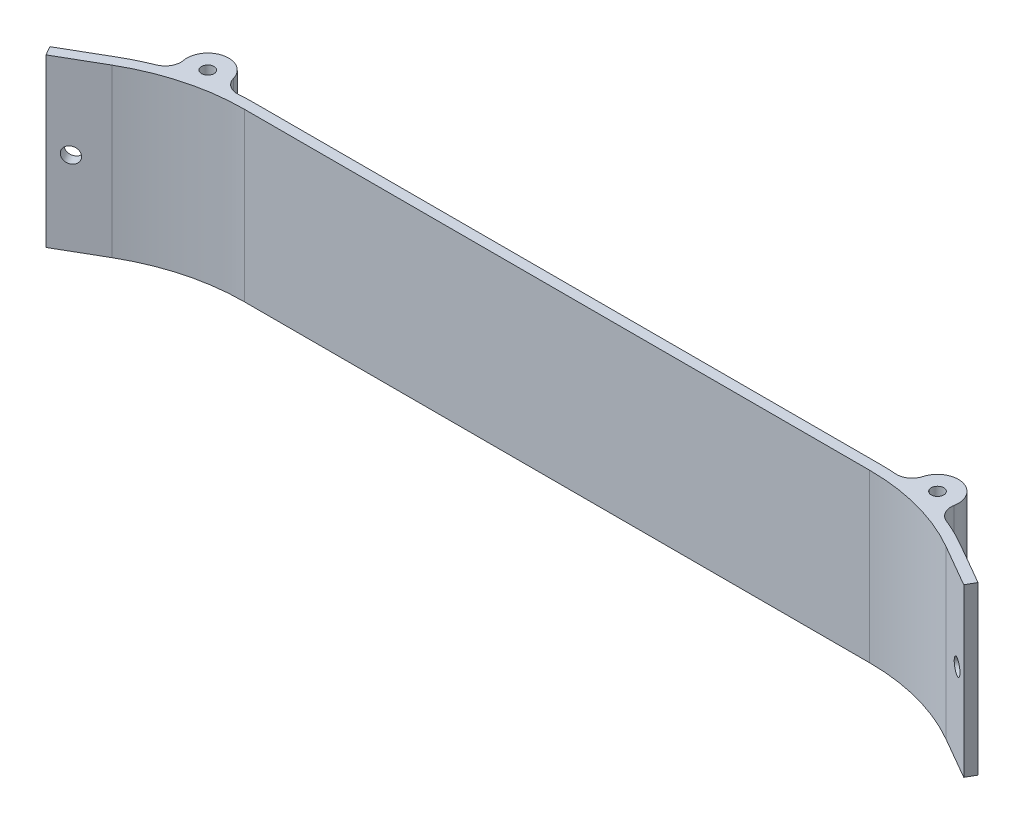
ISO-10303-21;
HEADER;
FILE_DESCRIPTION(('STEP AP214'),'2;1');
FILE_NAME('part.step','',(''),(''),'','','');
FILE_SCHEMA(('AUTOMOTIVE_DESIGN { 1 0 10303 214 1 1 1 1 }'));
ENDSEC;
DATA;
#1=APPLICATION_CONTEXT('core data for automotive mechanical design processes');
#2=APPLICATION_PROTOCOL_DEFINITION('international standard','automotive_design',2000,#1);
#3=PRODUCT_CONTEXT('',#1,'mechanical');
#4=PRODUCT('Part','Part','',(#3));
#5=PRODUCT_RELATED_PRODUCT_CATEGORY('part','',(#4));
#6=PRODUCT_DEFINITION_FORMATION('','',#4);
#7=PRODUCT_DEFINITION_CONTEXT('part definition',#1,'design');
#8=PRODUCT_DEFINITION('design','',#6,#7);
#9=PRODUCT_DEFINITION_SHAPE('','',#8);
#10=(LENGTH_UNIT() NAMED_UNIT(*) SI_UNIT(.MILLI.,.METRE.));
#11=(NAMED_UNIT(*) PLANE_ANGLE_UNIT() SI_UNIT($,.RADIAN.));
#12=(NAMED_UNIT(*) SI_UNIT($,.STERADIAN.) SOLID_ANGLE_UNIT());
#13=UNCERTAINTY_MEASURE_WITH_UNIT(LENGTH_MEASURE(1.E-05),#10,'distance_accuracy_value','');
#14=(GEOMETRIC_REPRESENTATION_CONTEXT(3) GLOBAL_UNCERTAINTY_ASSIGNED_CONTEXT((#13)) GLOBAL_UNIT_ASSIGNED_CONTEXT((#10,
#11,#12)) REPRESENTATION_CONTEXT('',''));
#15=CARTESIAN_POINT('',(0.,0.,0.));
#16=DIRECTION('',(0.,0.,1.));
#17=DIRECTION('',(1.,0.,0.));
#18=AXIS2_PLACEMENT_3D('',#15,#16,#17);
#19=CARTESIAN_POINT('',(-60.,32.,40.));
#20=DIRECTION('',(0.,-1.,0.));
#21=DIRECTION('',(0.,0.,-1.));
#22=AXIS2_PLACEMENT_3D('',#19,#20,#21);
#23=CYLINDRICAL_SURFACE('',#22,42.);
#24=CARTESIAN_POINT('',(-60.,0.,40.));
#25=DIRECTION('',(0.,1.,0.));
#26=DIRECTION('',(1.,0.,0.));
#27=AXIS2_PLACEMENT_3D('',#24,#25,#26);
#28=CIRCLE('',#27,42.);
#29=CARTESIAN_POINT('',(-60.,0.,-1.99999999999999));
#30=VERTEX_POINT('',#29);
#31=CARTESIAN_POINT('',(-63.0405375937342,0.,-1.8897974588215));
#32=VERTEX_POINT('',#31);
#33=EDGE_CURVE('E269',#30,#32,#28,.T.);
#34=ORIENTED_EDGE('',*,*,#33,.T.);
#35=DIRECTION('',(0.,-1.,0.));
#36=VECTOR('',#35,1.);
#37=CARTESIAN_POINT('',(-63.0405375937342,32.,-1.8897974588215));
#38=LINE('',#37,#36);
#39=CARTESIAN_POINT('',(-63.0405375937342,32.,-1.8897974588215));
#40=VERTEX_POINT('',#39);
#41=EDGE_CURVE('E325',#32,#40,#38,.F.);
#42=ORIENTED_EDGE('',*,*,#41,.T.);
#43=CARTESIAN_POINT('',(-60.,32.,40.));
#44=DIRECTION('',(0.,1.,0.));
#45=DIRECTION('',(1.,0.,0.));
#46=AXIS2_PLACEMENT_3D('',#43,#44,#45);
#47=CIRCLE('',#46,42.);
#48=CARTESIAN_POINT('',(-60.,32.,-1.99999999999999));
#49=VERTEX_POINT('',#48);
#50=EDGE_CURVE('E284',#49,#40,#47,.T.);
#51=ORIENTED_EDGE('',*,*,#50,.F.);
#52=DIRECTION('',(0.,-1.,0.));
#53=VECTOR('',#52,1.);
#54=CARTESIAN_POINT('',(-60.,32.,-1.99999999999999));
#55=LINE('',#54,#53);
#56=EDGE_CURVE('E308',#49,#30,#55,.T.);
#57=ORIENTED_EDGE('',*,*,#56,.T.);
#58=EDGE_LOOP('',(#34,#42,#51,#57));
#59=FACE_BOUND('',#58,.T.);
#60=ADVANCED_FACE('F32',(#59),#23,.T.);
#61=CARTESIAN_POINT('',(-75.7554261483558,32.,1.06715336783471));
#62=VERTEX_POINT('',#61);
#63=CARTESIAN_POINT('',(-81.,32.,3.62693304105363));
#64=VERTEX_POINT('',#63);
#65=EDGE_CURVE('E283',#62,#64,#47,.T.);
#66=ORIENTED_EDGE('',*,*,#65,.F.);
#67=DIRECTION('',(0.,-1.,0.));
#68=VECTOR('',#67,1.);
#69=CARTESIAN_POINT('',(-75.7554261483558,32.,1.0671533678347));
#70=LINE('',#69,#68);
#71=CARTESIAN_POINT('',(-75.7554261483558,0.,1.06715336783471));
#72=VERTEX_POINT('',#71);
#73=EDGE_CURVE('E53',#62,#72,#70,.T.);
#74=ORIENTED_EDGE('',*,*,#73,.T.);
#75=CARTESIAN_POINT('',(-81.,0.,3.62693304105363));
#76=VERTEX_POINT('',#75);
#77=EDGE_CURVE('E303',#72,#76,#28,.T.);
#78=ORIENTED_EDGE('',*,*,#77,.T.);
#79=DIRECTION('',(0.,-1.,0.));
#80=VECTOR('',#79,1.);
#81=CARTESIAN_POINT('',(-81.,32.,3.62693304105363));
#82=LINE('',#81,#80);
#83=EDGE_CURVE('E286',#64,#76,#82,.T.);
#84=ORIENTED_EDGE('',*,*,#83,.F.);
#85=EDGE_LOOP('',(#66,#74,#78,#84));
#86=FACE_BOUND('',#85,.T.);
#87=ADVANCED_FACE('F400',(#86),#23,.T.);
#88=CARTESIAN_POINT('',(-81.,32.,3.62693304105363));
#89=DIRECTION('',(0.500000000000001,0.,0.866025403784438));
#90=DIRECTION('',(0.866025403784438,0.,-0.500000000000001));
#91=AXIS2_PLACEMENT_3D('',#88,#89,#90);
#92=PLANE('',#91);
#93=CARTESIAN_POINT('',(-86.0073868596882,16.,6.51794919243116));
#94=DIRECTION('',(0.500000000000001,0.,0.866025403784438));
#95=DIRECTION('',(0.866025403784438,0.,-0.500000000000001));
#96=AXIS2_PLACEMENT_3D('',#93,#94,#95);
#97=CIRCLE('',#96,1.5);
#98=CARTESIAN_POINT('',(-84.7083487540115,16.,5.76794919243116));
#99=VERTEX_POINT('',#98);
#100=EDGE_CURVE('E251',#99,#99,#97,.T.);
#101=ORIENTED_EDGE('',*,*,#100,.T.);
#102=EDGE_LOOP('',(#101));
#103=FACE_BOUND('',#102,.T.);
#104=DIRECTION('',(-0.866025403784438,0.,0.500000000000001));
#105=VECTOR('',#104,1.);
#106=CARTESIAN_POINT('',(-81.,0.,3.62693304105363));
#107=LINE('',#106,#105);
#108=CARTESIAN_POINT('',(-89.0384757729337,0.,8.26794919243116));
#109=VERTEX_POINT('',#108);
#110=EDGE_CURVE('E257',#76,#109,#107,.T.);
#111=ORIENTED_EDGE('',*,*,#110,.T.);
#112=DIRECTION('',(0.,-1.,0.));
#113=VECTOR('',#112,1.);
#114=CARTESIAN_POINT('',(-89.0384757729337,32.,8.26794919243116));
#115=LINE('',#114,#113);
#116=CARTESIAN_POINT('',(-89.0384757729337,32.,8.26794919243116));
#117=VERTEX_POINT('',#116);
#118=EDGE_CURVE('E317',#117,#109,#115,.T.);
#119=ORIENTED_EDGE('',*,*,#118,.F.);
#120=DIRECTION('',(-0.866025403784438,0.,0.500000000000001));
#121=VECTOR('',#120,1.);
#122=CARTESIAN_POINT('',(-81.,32.,3.62693304105363));
#123=LINE('',#122,#121);
#124=EDGE_CURVE('E266',#64,#117,#123,.T.);
#125=ORIENTED_EDGE('',*,*,#124,.F.);
#126=ORIENTED_EDGE('',*,*,#83,.T.);
#127=EDGE_LOOP('',(#111,#119,#125,#126));
#128=FACE_BOUND('',#127,.T.);
#129=ADVANCED_FACE('F405',(#103,#128),#92,.F.);
#130=CARTESIAN_POINT('',(-88.0384757729337,32.,10.));
#131=DIRECTION('',(-0.866025403784438,0.,0.500000000000001));
#132=DIRECTION('',(0.500000000000001,0.,0.866025403784438));
#133=AXIS2_PLACEMENT_3D('',#130,#131,#132);
#134=PLANE('',#133);
#135=DIRECTION('',(-0.500000000000001,0.,-0.866025403784438));
#136=VECTOR('',#135,1.);
#137=CARTESIAN_POINT('',(-88.0384757729337,0.,10.));
#138=LINE('',#137,#136);
#139=CARTESIAN_POINT('',(-88.0384757729337,0.,10.));
#140=VERTEX_POINT('',#139);
#141=EDGE_CURVE('E289',#140,#109,#138,.T.);
#142=ORIENTED_EDGE('',*,*,#141,.F.);
#143=DIRECTION('',(0.,-1.,0.));
#144=VECTOR('',#143,1.);
#145=CARTESIAN_POINT('',(-88.0384757729337,32.,10.));
#146=LINE('',#145,#144);
#147=CARTESIAN_POINT('',(-88.0384757729337,32.,10.));
#148=VERTEX_POINT('',#147);
#149=EDGE_CURVE('E315',#148,#140,#146,.T.);
#150=ORIENTED_EDGE('',*,*,#149,.F.);
#151=DIRECTION('',(-0.500000000000001,0.,-0.866025403784438));
#152=VECTOR('',#151,1.);
#153=CARTESIAN_POINT('',(-88.0384757729337,32.,10.));
#154=LINE('',#153,#152);
#155=EDGE_CURVE('E268',#148,#117,#154,.T.);
#156=ORIENTED_EDGE('',*,*,#155,.T.);
#157=ORIENTED_EDGE('',*,*,#118,.T.);
#158=EDGE_LOOP('',(#142,#150,#156,#157));
#159=FACE_BOUND('',#158,.T.);
#160=ADVANCED_FACE('F422',(#159),#134,.T.);
#161=CARTESIAN_POINT('',(-80.,32.,5.3589838486225));
#162=DIRECTION('',(0.500000000000001,0.,0.866025403784438));
#163=DIRECTION('',(0.866025403784438,0.,-0.500000000000001));
#164=AXIS2_PLACEMENT_3D('',#161,#162,#163);
#165=PLANE('',#164);
#166=CARTESIAN_POINT('',(-85.0073868596882,16.,8.25000000000004));
#167=DIRECTION('',(0.500000000000001,0.,0.866025403784438));
#168=DIRECTION('',(0.866025403784438,0.,-0.500000000000001));
#169=AXIS2_PLACEMENT_3D('',#166,#167,#168);
#170=CIRCLE('',#169,1.5);
#171=CARTESIAN_POINT('',(-83.7083487540115,16.,7.50000000000003));
#172=VERTEX_POINT('',#171);
#173=EDGE_CURVE('E248',#172,#172,#170,.T.);
#174=ORIENTED_EDGE('',*,*,#173,.F.);
#175=EDGE_LOOP('',(#174));
#176=FACE_BOUND('',#175,.T.);
#177=DIRECTION('',(-0.866025403784438,0.,0.500000000000001));
#178=VECTOR('',#177,1.);
#179=CARTESIAN_POINT('',(-80.,0.,5.3589838486225));
#180=LINE('',#179,#178);
#181=CARTESIAN_POINT('',(-80.,0.,5.3589838486225));
#182=VERTEX_POINT('',#181);
#183=EDGE_CURVE('E292',#182,#140,#180,.T.);
#184=ORIENTED_EDGE('',*,*,#183,.F.);
#185=DIRECTION('',(0.,-1.,0.));
#186=VECTOR('',#185,1.);
#187=CARTESIAN_POINT('',(-80.,32.,5.3589838486225));
#188=LINE('',#187,#186);
#189=CARTESIAN_POINT('',(-80.,32.,5.3589838486225));
#190=VERTEX_POINT('',#189);
#191=EDGE_CURVE('E313',#190,#182,#188,.T.);
#192=ORIENTED_EDGE('',*,*,#191,.F.);
#193=DIRECTION('',(-0.866025403784438,0.,0.500000000000001));
#194=VECTOR('',#193,1.);
#195=CARTESIAN_POINT('',(-80.,32.,5.3589838486225));
#196=LINE('',#195,#194);
#197=EDGE_CURVE('E272',#190,#148,#196,.T.);
#198=ORIENTED_EDGE('',*,*,#197,.T.);
#199=ORIENTED_EDGE('',*,*,#149,.T.);
#200=EDGE_LOOP('',(#184,#192,#198,#199));
#201=FACE_BOUND('',#200,.T.);
#202=ADVANCED_FACE('F418',(#176,#201),#165,.T.);
#203=CARTESIAN_POINT('',(-60.,32.,40.));
#204=DIRECTION('',(0.,-1.,0.));
#205=DIRECTION('',(0.,0.,-1.));
#206=AXIS2_PLACEMENT_3D('',#203,#204,#205);
#207=CYLINDRICAL_SURFACE('',#206,40.);
#208=CARTESIAN_POINT('',(-60.,0.,40.));
#209=DIRECTION('',(0.,1.,0.));
#210=DIRECTION('',(0.,0.,1.));
#211=AXIS2_PLACEMENT_3D('',#208,#209,#210);
#212=CIRCLE('',#211,40.);
#213=CARTESIAN_POINT('',(-60.,0.,0.));
#214=VERTEX_POINT('',#213);
#215=EDGE_CURVE('E295',#214,#182,#212,.T.);
#216=ORIENTED_EDGE('',*,*,#215,.F.);
#217=DIRECTION('',(0.,-1.,0.));
#218=VECTOR('',#217,1.);
#219=CARTESIAN_POINT('',(-60.,32.,0.));
#220=LINE('',#219,#218);
#221=CARTESIAN_POINT('',(-60.,32.,0.));
#222=VERTEX_POINT('',#221);
#223=EDGE_CURVE('E311',#222,#214,#220,.T.);
#224=ORIENTED_EDGE('',*,*,#223,.F.);
#225=CARTESIAN_POINT('',(-60.,32.,40.));
#226=DIRECTION('',(0.,1.,0.));
#227=DIRECTION('',(0.,0.,1.));
#228=AXIS2_PLACEMENT_3D('',#225,#226,#227);
#229=CIRCLE('',#228,40.);
#230=EDGE_CURVE('E275',#222,#190,#229,.T.);
#231=ORIENTED_EDGE('',*,*,#230,.T.);
#232=ORIENTED_EDGE('',*,*,#191,.T.);
#233=EDGE_LOOP('',(#216,#224,#231,#232));
#234=FACE_BOUND('',#233,.T.);
#235=ADVANCED_FACE('F414',(#234),#207,.F.);
#236=CARTESIAN_POINT('',(0.,32.,0.));
#237=DIRECTION('',(0.,0.,1.));
#238=DIRECTION('',(1.,0.,0.));
#239=AXIS2_PLACEMENT_3D('',#236,#237,#238);
#240=PLANE('',#239);
#241=DIRECTION('',(-1.,0.,0.));
#242=VECTOR('',#241,1.);
#243=CARTESIAN_POINT('',(0.,0.,0.));
#244=LINE('',#243,#242);
#245=CARTESIAN_POINT('',(60.,0.,0.));
#246=VERTEX_POINT('',#245);
#247=EDGE_CURVE('E298',#246,#214,#244,.T.);
#248=ORIENTED_EDGE('',*,*,#247,.F.);
#249=DIRECTION('',(0.,-1.,0.));
#250=VECTOR('',#249,1.);
#251=CARTESIAN_POINT('',(60.,32.,0.));
#252=LINE('',#251,#250);
#253=CARTESIAN_POINT('',(60.,32.,0.));
#254=VERTEX_POINT('',#253);
#255=EDGE_CURVE('E222',#254,#246,#252,.T.);
#256=ORIENTED_EDGE('',*,*,#255,.F.);
#257=DIRECTION('',(-1.,0.,0.));
#258=VECTOR('',#257,1.);
#259=CARTESIAN_POINT('',(0.,32.,0.));
#260=LINE('',#259,#258);
#261=EDGE_CURVE('E278',#254,#222,#260,.T.);
#262=ORIENTED_EDGE('',*,*,#261,.T.);
#263=ORIENTED_EDGE('',*,*,#223,.T.);
#264=EDGE_LOOP('',(#248,#256,#262,#263));
#265=FACE_BOUND('',#264,.T.);
#266=ADVANCED_FACE('F411',(#265),#240,.T.);
#267=CARTESIAN_POINT('',(0.,32.,-2.));
#268=DIRECTION('',(0.,0.,1.));
#269=DIRECTION('',(1.,0.,0.));
#270=AXIS2_PLACEMENT_3D('',#267,#268,#269);
#271=PLANE('',#270);
#272=DIRECTION('',(-1.,0.,0.));
#273=VECTOR('',#272,1.);
#274=CARTESIAN_POINT('',(0.,0.,-2.));
#275=LINE('',#274,#273);
#276=CARTESIAN_POINT('',(60.,0.,-2.));
#277=VERTEX_POINT('',#276);
#278=EDGE_CURVE('E301',#277,#30,#275,.T.);
#279=ORIENTED_EDGE('',*,*,#278,.T.);
#280=ORIENTED_EDGE('',*,*,#56,.F.);
#281=DIRECTION('',(-1.,0.,0.));
#282=VECTOR('',#281,1.);
#283=CARTESIAN_POINT('',(0.,32.,-2.));
#284=LINE('',#283,#282);
#285=CARTESIAN_POINT('',(60.,32.,-2.));
#286=VERTEX_POINT('',#285);
#287=EDGE_CURVE('E281',#286,#49,#284,.T.);
#288=ORIENTED_EDGE('',*,*,#287,.F.);
#289=DIRECTION('',(0.,-1.,0.));
#290=VECTOR('',#289,1.);
#291=CARTESIAN_POINT('',(60.,32.,-2.));
#292=LINE('',#291,#290);
#293=EDGE_CURVE('E219',#286,#277,#292,.T.);
#294=ORIENTED_EDGE('',*,*,#293,.T.);
#295=EDGE_LOOP('',(#279,#280,#288,#294));
#296=FACE_BOUND('',#295,.T.);
#297=ADVANCED_FACE('F349',(#296),#271,.F.);
#298=CARTESIAN_POINT('',(-60.,32.,40.));
#299=DIRECTION('',(0.,1.,0.));
#300=DIRECTION('',(1.,0.,0.));
#301=AXIS2_PLACEMENT_3D('',#298,#299,#300);
#302=PLANE('',#301);
#303=ORIENTED_EDGE('',*,*,#50,.T.);
#304=CARTESIAN_POINT('',(-63.2577188504295,32.,-4.88192584873733));
#305=DIRECTION('',(0.,1.,0.));
#306=DIRECTION('',(0.,0.,1.));
#307=AXIS2_PLACEMENT_3D('',#304,#305,#306);
#308=CIRCLE('',#307,3.);
#309=CARTESIAN_POINT('',(-66.1472679145311,32.,-4.07538619927847));
#310=VERTEX_POINT('',#309);
#311=EDGE_CURVE('E330',#40,#310,#308,.F.);
#312=ORIENTED_EDGE('',*,*,#311,.T.);
#313=CARTESIAN_POINT('',(-70.,32.,-3.));
#314=DIRECTION('',(0.,1.,0.));
#315=DIRECTION('',(0.,0.,1.));
#316=AXIS2_PLACEMENT_3D('',#313,#314,#315);
#317=CIRCLE('',#316,4.00000000000001);
#318=CARTESIAN_POINT('',(-73.9318935602178,32.,-2.26500814214202));
#319=VERTEX_POINT('',#318);
#320=EDGE_CURVE('E255',#310,#319,#317,.T.);
#321=ORIENTED_EDGE('',*,*,#320,.T.);
#322=CARTESIAN_POINT('',(-76.8808137303812,32.,-1.71376424874854));
#323=DIRECTION('',(0.,1.,0.));
#324=DIRECTION('',(0.,0.,1.));
#325=AXIS2_PLACEMENT_3D('',#322,#323,#324);
#326=CIRCLE('',#325,3.);
#327=EDGE_CURVE('E40',#319,#62,#326,.F.);
#328=ORIENTED_EDGE('',*,*,#327,.T.);
#329=ORIENTED_EDGE('',*,*,#65,.T.);
#330=ORIENTED_EDGE('',*,*,#124,.T.);
#331=ORIENTED_EDGE('',*,*,#155,.F.);
#332=ORIENTED_EDGE('',*,*,#197,.F.);
#333=ORIENTED_EDGE('',*,*,#230,.F.);
#334=ORIENTED_EDGE('',*,*,#261,.F.);
#335=CARTESIAN_POINT('',(60.,32.,40.));
#336=DIRECTION('',(0.,-1.,0.));
#337=DIRECTION('',(0.,0.,1.));
#338=AXIS2_PLACEMENT_3D('',#335,#336,#337);
#339=CIRCLE('',#338,40.);
#340=CARTESIAN_POINT('',(80.,32.,5.35898384862248));
#341=VERTEX_POINT('',#340);
#342=EDGE_CURVE('E204',#254,#341,#339,.T.);
#343=ORIENTED_EDGE('',*,*,#342,.T.);
#344=DIRECTION('',(0.866025403784438,0.,0.500000000000001));
#345=VECTOR('',#344,1.);
#346=CARTESIAN_POINT('',(80.,32.,5.35898384862248));
#347=LINE('',#346,#345);
#348=CARTESIAN_POINT('',(88.0384757729337,32.,10.));
#349=VERTEX_POINT('',#348);
#350=EDGE_CURVE('E175',#341,#349,#347,.T.);
#351=ORIENTED_EDGE('',*,*,#350,.T.);
#352=DIRECTION('',(0.500000000000001,0.,-0.866025403784438));
#353=VECTOR('',#352,1.);
#354=CARTESIAN_POINT('',(88.0384757729337,32.,10.));
#355=LINE('',#354,#353);
#356=CARTESIAN_POINT('',(89.0384757729337,32.,8.26794919243114));
#357=VERTEX_POINT('',#356);
#358=EDGE_CURVE('E165',#349,#357,#355,.T.);
#359=ORIENTED_EDGE('',*,*,#358,.T.);
#360=DIRECTION('',(0.866025403784438,0.,0.500000000000001));
#361=VECTOR('',#360,1.);
#362=CARTESIAN_POINT('',(81.,32.,3.62693304105361));
#363=LINE('',#362,#361);
#364=CARTESIAN_POINT('',(81.,32.,3.62693304105361));
#365=VERTEX_POINT('',#364);
#366=EDGE_CURVE('E172',#365,#357,#363,.T.);
#367=ORIENTED_EDGE('',*,*,#366,.F.);
#368=CARTESIAN_POINT('',(60.,32.,40.));
#369=DIRECTION('',(0.,-1.,0.));
#370=DIRECTION('',(-1.,0.,0.));
#371=AXIS2_PLACEMENT_3D('',#368,#369,#370);
#372=CIRCLE('',#371,42.);
#373=CARTESIAN_POINT('',(75.7554261483558,32.,1.06715336783469));
#374=VERTEX_POINT('',#373);
#375=EDGE_CURVE('E206',#374,#365,#372,.T.);
#376=ORIENTED_EDGE('',*,*,#375,.F.);
#377=CARTESIAN_POINT('',(76.8808137303812,32.,-1.71376424874856));
#378=DIRECTION('',(0.,-1.,0.));
#379=DIRECTION('',(0.,0.,1.));
#380=AXIS2_PLACEMENT_3D('',#377,#378,#379);
#381=CIRCLE('',#380,3.);
#382=CARTESIAN_POINT('',(73.9318935602178,32.,-2.26500814214204));
#383=VERTEX_POINT('',#382);
#384=EDGE_CURVE('E243',#383,#374,#381,.F.);
#385=ORIENTED_EDGE('',*,*,#384,.F.);
#386=CARTESIAN_POINT('',(70.,32.,-3.00000000000002));
#387=DIRECTION('',(0.,-1.,0.));
#388=DIRECTION('',(0.,0.,1.));
#389=AXIS2_PLACEMENT_3D('',#386,#387,#388);
#390=CIRCLE('',#389,4.00000000000001);
#391=CARTESIAN_POINT('',(66.1472679145311,32.,-4.07538619927849));
#392=VERTEX_POINT('',#391);
#393=EDGE_CURVE('E212',#392,#383,#390,.T.);
#394=ORIENTED_EDGE('',*,*,#393,.F.);
#395=CARTESIAN_POINT('',(63.2577188504295,32.,-4.88192584873734));
#396=DIRECTION('',(0.,-1.,0.));
#397=DIRECTION('',(0.,0.,1.));
#398=AXIS2_PLACEMENT_3D('',#395,#396,#397);
#399=CIRCLE('',#398,3.);
#400=CARTESIAN_POINT('',(63.0405375937342,32.,-1.88979745882152));
#401=VERTEX_POINT('',#400);
#402=EDGE_CURVE('E240',#401,#392,#399,.F.);
#403=ORIENTED_EDGE('',*,*,#402,.F.);
#404=EDGE_CURVE('E207',#286,#401,#372,.T.);
#405=ORIENTED_EDGE('',*,*,#404,.F.);
#406=ORIENTED_EDGE('',*,*,#287,.T.);
#407=EDGE_LOOP('',(#303,#312,#321,#328,#329,#330,#331,#332,#333,#334,#343,#351,#359,#367,#376,
#385,#394,#403,#405,#406));
#408=FACE_BOUND('',#407,.T.);
#409=CARTESIAN_POINT('',(-70.,32.,-3.));
#410=DIRECTION('',(0.,1.,0.));
#411=DIRECTION('',(0.,0.,1.));
#412=AXIS2_PLACEMENT_3D('',#409,#410,#411);
#413=CIRCLE('',#412,1.2);
#414=CARTESIAN_POINT('',(-70.,32.,-1.8));
#415=VERTEX_POINT('',#414);
#416=EDGE_CURVE('E254',#415,#415,#413,.T.);
#417=ORIENTED_EDGE('',*,*,#416,.F.);
#418=EDGE_LOOP('',(#417));
#419=FACE_BOUND('',#418,.T.);
#420=CARTESIAN_POINT('',(70.,32.,-3.00000000000002));
#421=DIRECTION('',(0.,-1.,0.));
#422=DIRECTION('',(0.,0.,1.));
#423=AXIS2_PLACEMENT_3D('',#420,#421,#422);
#424=CIRCLE('',#423,1.2);
#425=CARTESIAN_POINT('',(70.,32.,-1.80000000000002));
#426=VERTEX_POINT('',#425);
#427=EDGE_CURVE('E200',#426,#426,#424,.T.);
#428=ORIENTED_EDGE('',*,*,#427,.T.);
#429=EDGE_LOOP('',(#428));
#430=FACE_BOUND('',#429,.T.);
#431=ADVANCED_FACE('F168',(#408,#419,#430),#302,.T.);
#432=CARTESIAN_POINT('',(-60.,0.,40.));
#433=DIRECTION('',(0.,1.,0.));
#434=DIRECTION('',(1.,0.,0.));
#435=AXIS2_PLACEMENT_3D('',#432,#433,#434);
#436=PLANE('',#435);
#437=ORIENTED_EDGE('',*,*,#77,.F.);
#438=CARTESIAN_POINT('',(-76.8808137303812,0.,-1.71376424874854));
#439=DIRECTION('',(0.,1.,0.));
#440=DIRECTION('',(0.,0.,1.));
#441=AXIS2_PLACEMENT_3D('',#438,#439,#440);
#442=CIRCLE('',#441,3.);
#443=CARTESIAN_POINT('',(-73.9318935602178,0.,-2.26500814214202));
#444=VERTEX_POINT('',#443);
#445=EDGE_CURVE('E11',#72,#444,#442,.T.);
#446=ORIENTED_EDGE('',*,*,#445,.T.);
#447=CARTESIAN_POINT('',(-70.,0.,-3.));
#448=DIRECTION('',(0.,1.,0.));
#449=DIRECTION('',(0.,0.,1.));
#450=AXIS2_PLACEMENT_3D('',#447,#448,#449);
#451=CIRCLE('',#450,4.00000000000001);
#452=CARTESIAN_POINT('',(-66.1472679145311,0.,-4.07538619927847));
#453=VERTEX_POINT('',#452);
#454=EDGE_CURVE('E258',#453,#444,#451,.T.);
#455=ORIENTED_EDGE('',*,*,#454,.F.);
#456=CARTESIAN_POINT('',(-63.2577188504295,0.,-4.88192584873733));
#457=DIRECTION('',(0.,1.,0.));
#458=DIRECTION('',(0.,0.,1.));
#459=AXIS2_PLACEMENT_3D('',#456,#457,#458);
#460=CIRCLE('',#459,3.);
#461=EDGE_CURVE('E328',#453,#32,#460,.T.);
#462=ORIENTED_EDGE('',*,*,#461,.T.);
#463=ORIENTED_EDGE('',*,*,#33,.F.);
#464=ORIENTED_EDGE('',*,*,#278,.F.);
#465=CARTESIAN_POINT('',(60.,0.,40.));
#466=DIRECTION('',(0.,-1.,0.));
#467=DIRECTION('',(-1.,0.,0.));
#468=AXIS2_PLACEMENT_3D('',#465,#466,#467);
#469=CIRCLE('',#468,42.);
#470=CARTESIAN_POINT('',(63.0405375937342,0.,-1.88979745882152));
#471=VERTEX_POINT('',#470);
#472=EDGE_CURVE('E194',#277,#471,#469,.T.);
#473=ORIENTED_EDGE('',*,*,#472,.T.);
#474=CARTESIAN_POINT('',(63.2577188504295,0.,-4.88192584873734));
#475=DIRECTION('',(0.,-1.,0.));
#476=DIRECTION('',(0.,0.,1.));
#477=AXIS2_PLACEMENT_3D('',#474,#475,#476);
#478=CIRCLE('',#477,3.);
#479=CARTESIAN_POINT('',(66.1472679145311,0.,-4.07538619927849));
#480=VERTEX_POINT('',#479);
#481=EDGE_CURVE('E238',#480,#471,#478,.T.);
#482=ORIENTED_EDGE('',*,*,#481,.F.);
#483=CARTESIAN_POINT('',(70.,0.,-3.00000000000002));
#484=DIRECTION('',(0.,-1.,0.));
#485=DIRECTION('',(0.,0.,1.));
#486=AXIS2_PLACEMENT_3D('',#483,#484,#485);
#487=CIRCLE('',#486,4.00000000000001);
#488=CARTESIAN_POINT('',(73.9318935602178,0.,-2.26500814214204));
#489=VERTEX_POINT('',#488);
#490=EDGE_CURVE('E364',#480,#489,#487,.T.);
#491=ORIENTED_EDGE('',*,*,#490,.T.);
#492=CARTESIAN_POINT('',(76.8808137303812,0.,-1.71376424874856));
#493=DIRECTION('',(0.,-1.,0.));
#494=DIRECTION('',(0.,0.,1.));
#495=AXIS2_PLACEMENT_3D('',#492,#493,#494);
#496=CIRCLE('',#495,3.);
#497=CARTESIAN_POINT('',(75.7554261483558,0.,1.06715336783469));
#498=VERTEX_POINT('',#497);
#499=EDGE_CURVE('E245',#498,#489,#496,.T.);
#500=ORIENTED_EDGE('',*,*,#499,.F.);
#501=CARTESIAN_POINT('',(81.,0.,3.62693304105361));
#502=VERTEX_POINT('',#501);
#503=EDGE_CURVE('E197',#498,#502,#469,.T.);
#504=ORIENTED_EDGE('',*,*,#503,.T.);
#505=DIRECTION('',(0.866025403784438,0.,0.500000000000001));
#506=VECTOR('',#505,1.);
#507=CARTESIAN_POINT('',(81.,0.,3.62693304105361));
#508=LINE('',#507,#506);
#509=CARTESIAN_POINT('',(89.0384757729337,0.,8.26794919243114));
#510=VERTEX_POINT('',#509);
#511=EDGE_CURVE('E210',#502,#510,#508,.T.);
#512=ORIENTED_EDGE('',*,*,#511,.T.);
#513=DIRECTION('',(0.500000000000001,0.,-0.866025403784438));
#514=VECTOR('',#513,1.);
#515=CARTESIAN_POINT('',(88.0384757729337,0.,10.));
#516=LINE('',#515,#514);
#517=CARTESIAN_POINT('',(88.0384757729337,0.,10.));
#518=VERTEX_POINT('',#517);
#519=EDGE_CURVE('E184',#518,#510,#516,.T.);
#520=ORIENTED_EDGE('',*,*,#519,.F.);
#521=DIRECTION('',(0.866025403784438,0.,0.500000000000001));
#522=VECTOR('',#521,1.);
#523=CARTESIAN_POINT('',(80.,0.,5.35898384862248));
#524=LINE('',#523,#522);
#525=CARTESIAN_POINT('',(80.,0.,5.35898384862248));
#526=VERTEX_POINT('',#525);
#527=EDGE_CURVE('E214',#526,#518,#524,.T.);
#528=ORIENTED_EDGE('',*,*,#527,.F.);
#529=CARTESIAN_POINT('',(60.,0.,40.));
#530=DIRECTION('',(0.,-1.,0.));
#531=DIRECTION('',(0.,0.,1.));
#532=AXIS2_PLACEMENT_3D('',#529,#530,#531);
#533=CIRCLE('',#532,40.);
#534=EDGE_CURVE('E216',#246,#526,#533,.T.);
#535=ORIENTED_EDGE('',*,*,#534,.F.);
#536=ORIENTED_EDGE('',*,*,#247,.T.);
#537=ORIENTED_EDGE('',*,*,#215,.T.);
#538=ORIENTED_EDGE('',*,*,#183,.T.);
#539=ORIENTED_EDGE('',*,*,#141,.T.);
#540=ORIENTED_EDGE('',*,*,#110,.F.);
#541=EDGE_LOOP('',(#437,#446,#455,#462,#463,#464,#473,#482,#491,#500,#504,#512,#520,#528,#535,
#536,#537,#538,#539,#540));
#542=FACE_BOUND('',#541,.T.);
#543=CARTESIAN_POINT('',(-70.,0.,-3.));
#544=DIRECTION('',(0.,1.,0.));
#545=DIRECTION('',(0.,0.,1.));
#546=AXIS2_PLACEMENT_3D('',#543,#544,#545);
#547=CIRCLE('',#546,1.2);
#548=CARTESIAN_POINT('',(-70.,0.,-1.8));
#549=VERTEX_POINT('',#548);
#550=EDGE_CURVE('E259',#549,#549,#547,.T.);
#551=ORIENTED_EDGE('',*,*,#550,.T.);
#552=EDGE_LOOP('',(#551));
#553=FACE_BOUND('',#552,.T.);
#554=CARTESIAN_POINT('',(70.,0.,-3.00000000000002));
#555=DIRECTION('',(0.,-1.,0.));
#556=DIRECTION('',(0.,0.,1.));
#557=AXIS2_PLACEMENT_3D('',#554,#555,#556);
#558=CIRCLE('',#557,1.2);
#559=CARTESIAN_POINT('',(70.,0.,-1.80000000000002));
#560=VERTEX_POINT('',#559);
#561=EDGE_CURVE('E366',#560,#560,#558,.T.);
#562=ORIENTED_EDGE('',*,*,#561,.F.);
#563=EDGE_LOOP('',(#562));
#564=FACE_BOUND('',#563,.T.);
#565=ADVANCED_FACE('F344',(#542,#553,#564),#436,.F.);
#566=CARTESIAN_POINT('',(-70.,43.3137084989848,-3.));
#567=DIRECTION('',(0.,-1.,0.));
#568=DIRECTION('',(0.,0.,-1.));
#569=AXIS2_PLACEMENT_3D('',#566,#567,#568);
#570=CYLINDRICAL_SURFACE('',#569,4.00000000000001);
#571=ORIENTED_EDGE('',*,*,#320,.F.);
#572=DIRECTION('',(0.,-1.,0.));
#573=VECTOR('',#572,1.);
#574=CARTESIAN_POINT('',(-66.1472679145311,43.3137084989848,-4.07538619927847));
#575=LINE('',#574,#573);
#576=EDGE_CURVE('E322',#310,#453,#575,.T.);
#577=ORIENTED_EDGE('',*,*,#576,.T.);
#578=ORIENTED_EDGE('',*,*,#454,.T.);
#579=DIRECTION('',(0.,-1.,0.));
#580=VECTOR('',#579,1.);
#581=CARTESIAN_POINT('',(-73.9318935602178,43.3137084989848,-2.26500814214202));
#582=LINE('',#581,#580);
#583=EDGE_CURVE('E319',#444,#319,#582,.F.);
#584=ORIENTED_EDGE('',*,*,#583,.T.);
#585=EDGE_LOOP('',(#571,#577,#578,#584));
#586=FACE_BOUND('',#585,.T.);
#587=ADVANCED_FACE('F338',(#586),#570,.T.);
#588=CARTESIAN_POINT('',(-70.,43.3137084989848,-3.));
#589=DIRECTION('',(0.,-1.,0.));
#590=DIRECTION('',(0.,0.,-1.));
#591=AXIS2_PLACEMENT_3D('',#588,#589,#590);
#592=CYLINDRICAL_SURFACE('',#591,1.2);
#593=ORIENTED_EDGE('',*,*,#550,.F.);
#594=EDGE_LOOP('',(#593));
#595=FACE_BOUND('',#594,.T.);
#596=ORIENTED_EDGE('',*,*,#416,.T.);
#597=EDGE_LOOP('',(#596));
#598=FACE_BOUND('',#597,.T.);
#599=ADVANCED_FACE('F430',(#595,#598),#592,.F.);
#600=CARTESIAN_POINT('',(-63.2577188504295,32.,-4.88192584873733));
#601=DIRECTION('',(0.,1.,0.));
#602=DIRECTION('',(0.,0.,1.));
#603=AXIS2_PLACEMENT_3D('',#600,#601,#602);
#604=CYLINDRICAL_SURFACE('',#603,3.);
#605=ORIENTED_EDGE('',*,*,#311,.F.);
#606=ORIENTED_EDGE('',*,*,#41,.F.);
#607=ORIENTED_EDGE('',*,*,#461,.F.);
#608=ORIENTED_EDGE('',*,*,#576,.F.);
#609=EDGE_LOOP('',(#605,#606,#607,#608));
#610=FACE_BOUND('',#609,.T.);
#611=ADVANCED_FACE('F341',(#610),#604,.F.);
#612=CARTESIAN_POINT('',(-76.8808137303812,32.,-1.71376424874854));
#613=DIRECTION('',(0.,-1.,0.));
#614=DIRECTION('',(0.,0.,-1.));
#615=AXIS2_PLACEMENT_3D('',#612,#613,#614);
#616=CYLINDRICAL_SURFACE('',#615,3.);
#617=ORIENTED_EDGE('',*,*,#445,.F.);
#618=ORIENTED_EDGE('',*,*,#73,.F.);
#619=ORIENTED_EDGE('',*,*,#327,.F.);
#620=ORIENTED_EDGE('',*,*,#583,.F.);
#621=EDGE_LOOP('',(#617,#618,#619,#620));
#622=FACE_BOUND('',#621,.T.);
#623=ADVANCED_FACE('F34',(#622),#616,.F.);
#624=CARTESIAN_POINT('',(-92.6186027918559,16.,-4.93301270189219));
#625=DIRECTION('',(0.500000000000001,0.,0.866025403784438));
#626=DIRECTION('',(0.866025403784438,0.,-0.500000000000001));
#627=AXIS2_PLACEMENT_3D('',#624,#625,#626);
#628=CYLINDRICAL_SURFACE('',#627,1.5);
#629=ORIENTED_EDGE('',*,*,#173,.T.);
#630=EDGE_LOOP('',(#629));
#631=FACE_BOUND('',#630,.T.);
#632=ORIENTED_EDGE('',*,*,#100,.F.);
#633=EDGE_LOOP('',(#632));
#634=FACE_BOUND('',#633,.T.);
#635=ADVANCED_FACE('F435',(#631,#634),#628,.F.);
#636=CARTESIAN_POINT('',(60.,32.,40.));
#637=DIRECTION('',(0.,-1.,0.));
#638=DIRECTION('',(0.,0.,-1.));
#639=AXIS2_PLACEMENT_3D('',#636,#637,#638);
#640=CYLINDRICAL_SURFACE('',#639,42.);
#641=ORIENTED_EDGE('',*,*,#472,.F.);
#642=ORIENTED_EDGE('',*,*,#293,.F.);
#643=ORIENTED_EDGE('',*,*,#404,.T.);
#644=DIRECTION('',(0.,-1.,0.));
#645=VECTOR('',#644,1.);
#646=CARTESIAN_POINT('',(63.0405375937342,32.,-1.88979745882152));
#647=LINE('',#646,#645);
#648=EDGE_CURVE('E232',#471,#401,#647,.F.);
#649=ORIENTED_EDGE('',*,*,#648,.F.);
#650=EDGE_LOOP('',(#641,#642,#643,#649));
#651=FACE_BOUND('',#650,.T.);
#652=ADVANCED_FACE('F357',(#651),#640,.T.);
#653=ORIENTED_EDGE('',*,*,#375,.T.);
#654=DIRECTION('',(0.,-1.,0.));
#655=VECTOR('',#654,1.);
#656=CARTESIAN_POINT('',(81.,32.,3.62693304105361));
#657=LINE('',#656,#655);
#658=EDGE_CURVE('E192',#365,#502,#657,.T.);
#659=ORIENTED_EDGE('',*,*,#658,.T.);
#660=ORIENTED_EDGE('',*,*,#503,.F.);
#661=DIRECTION('',(0.,-1.,0.));
#662=VECTOR('',#661,1.);
#663=CARTESIAN_POINT('',(75.7554261483558,32.,1.06715336783468));
#664=LINE('',#663,#662);
#665=EDGE_CURVE('E235',#374,#498,#664,.T.);
#666=ORIENTED_EDGE('',*,*,#665,.F.);
#667=EDGE_LOOP('',(#653,#659,#660,#666));
#668=FACE_BOUND('',#667,.T.);
#669=ADVANCED_FACE('F389',(#668),#640,.T.);
#670=CARTESIAN_POINT('',(81.,32.,3.62693304105361));
#671=DIRECTION('',(-0.500000000000001,0.,0.866025403784438));
#672=DIRECTION('',(-0.866025403784438,0.,-0.500000000000001));
#673=AXIS2_PLACEMENT_3D('',#670,#671,#672);
#674=PLANE('',#673);
#675=CARTESIAN_POINT('',(86.0073868596882,16.,6.51794919243114));
#676=DIRECTION('',(0.500000000000001,0.,-0.866025403784438));
#677=DIRECTION('',(-0.866025403784438,0.,-0.500000000000001));
#678=AXIS2_PLACEMENT_3D('',#675,#676,#677);
#679=CIRCLE('',#678,1.5);
#680=CARTESIAN_POINT('',(84.7083487540115,16.,5.76794919243114));
#681=VERTEX_POINT('',#680);
#682=EDGE_CURVE('E371',#681,#681,#679,.T.);
#683=ORIENTED_EDGE('',*,*,#682,.F.);
#684=EDGE_LOOP('',(#683));
#685=FACE_BOUND('',#684,.T.);
#686=ORIENTED_EDGE('',*,*,#511,.F.);
#687=ORIENTED_EDGE('',*,*,#658,.F.);
#688=ORIENTED_EDGE('',*,*,#366,.T.);
#689=DIRECTION('',(0.,-1.,0.));
#690=VECTOR('',#689,1.);
#691=CARTESIAN_POINT('',(89.0384757729337,32.,8.26794919243114));
#692=LINE('',#691,#690);
#693=EDGE_CURVE('E181',#357,#510,#692,.T.);
#694=ORIENTED_EDGE('',*,*,#693,.T.);
#695=EDGE_LOOP('',(#686,#687,#688,#694));
#696=FACE_BOUND('',#695,.T.);
#697=ADVANCED_FACE('F190',(#685,#696),#674,.F.);
#698=CARTESIAN_POINT('',(88.0384757729337,32.,10.));
#699=DIRECTION('',(0.866025403784438,0.,0.500000000000001));
#700=DIRECTION('',(-0.500000000000001,0.,0.866025403784438));
#701=AXIS2_PLACEMENT_3D('',#698,#699,#700);
#702=PLANE('',#701);
#703=ORIENTED_EDGE('',*,*,#519,.T.);
#704=ORIENTED_EDGE('',*,*,#693,.F.);
#705=ORIENTED_EDGE('',*,*,#358,.F.);
#706=DIRECTION('',(0.,-1.,0.));
#707=VECTOR('',#706,1.);
#708=CARTESIAN_POINT('',(88.0384757729337,32.,10.));
#709=LINE('',#708,#707);
#710=EDGE_CURVE('E188',#349,#518,#709,.T.);
#711=ORIENTED_EDGE('',*,*,#710,.T.);
#712=EDGE_LOOP('',(#703,#704,#705,#711));
#713=FACE_BOUND('',#712,.T.);
#714=ADVANCED_FACE('F182',(#713),#702,.T.);
#715=CARTESIAN_POINT('',(80.,32.,5.35898384862248));
#716=DIRECTION('',(-0.500000000000001,0.,0.866025403784438));
#717=DIRECTION('',(-0.866025403784438,0.,-0.500000000000001));
#718=AXIS2_PLACEMENT_3D('',#715,#716,#717);
#719=PLANE('',#718);
#720=CARTESIAN_POINT('',(85.0073868596882,16.,8.25000000000001));
#721=DIRECTION('',(0.500000000000001,0.,-0.866025403784438));
#722=DIRECTION('',(-0.866025403784438,0.,-0.500000000000001));
#723=AXIS2_PLACEMENT_3D('',#720,#721,#722);
#724=CIRCLE('',#723,1.5);
#725=CARTESIAN_POINT('',(83.7083487540115,16.,7.50000000000001));
#726=VERTEX_POINT('',#725);
#727=EDGE_CURVE('E374',#726,#726,#724,.T.);
#728=ORIENTED_EDGE('',*,*,#727,.T.);
#729=EDGE_LOOP('',(#728));
#730=FACE_BOUND('',#729,.T.);
#731=ORIENTED_EDGE('',*,*,#527,.T.);
#732=ORIENTED_EDGE('',*,*,#710,.F.);
#733=ORIENTED_EDGE('',*,*,#350,.F.);
#734=DIRECTION('',(0.,-1.,0.));
#735=VECTOR('',#734,1.);
#736=CARTESIAN_POINT('',(80.,32.,5.35898384862248));
#737=LINE('',#736,#735);
#738=EDGE_CURVE('E225',#341,#526,#737,.T.);
#739=ORIENTED_EDGE('',*,*,#738,.T.);
#740=EDGE_LOOP('',(#731,#732,#733,#739));
#741=FACE_BOUND('',#740,.T.);
#742=ADVANCED_FACE('F378',(#730,#741),#719,.T.);
#743=CARTESIAN_POINT('',(60.,32.,40.));
#744=DIRECTION('',(0.,-1.,0.));
#745=DIRECTION('',(0.,0.,-1.));
#746=AXIS2_PLACEMENT_3D('',#743,#744,#745);
#747=CYLINDRICAL_SURFACE('',#746,40.);
#748=ORIENTED_EDGE('',*,*,#534,.T.);
#749=ORIENTED_EDGE('',*,*,#738,.F.);
#750=ORIENTED_EDGE('',*,*,#342,.F.);
#751=ORIENTED_EDGE('',*,*,#255,.T.);
#752=EDGE_LOOP('',(#748,#749,#750,#751));
#753=FACE_BOUND('',#752,.T.);
#754=ADVANCED_FACE('F526',(#753),#747,.F.);
#755=CARTESIAN_POINT('',(70.,43.3137084989848,-3.00000000000002));
#756=DIRECTION('',(0.,-1.,0.));
#757=DIRECTION('',(0.,0.,-1.));
#758=AXIS2_PLACEMENT_3D('',#755,#756,#757);
#759=CYLINDRICAL_SURFACE('',#758,4.00000000000001);
#760=ORIENTED_EDGE('',*,*,#393,.T.);
#761=DIRECTION('',(0.,-1.,0.));
#762=VECTOR('',#761,1.);
#763=CARTESIAN_POINT('',(73.9318935602178,43.3137084989848,-2.26500814214204));
#764=LINE('',#763,#762);
#765=EDGE_CURVE('E187',#489,#383,#764,.F.);
#766=ORIENTED_EDGE('',*,*,#765,.F.);
#767=ORIENTED_EDGE('',*,*,#490,.F.);
#768=DIRECTION('',(0.,-1.,0.));
#769=VECTOR('',#768,1.);
#770=CARTESIAN_POINT('',(66.1472679145311,43.3137084989848,-4.07538619927849));
#771=LINE('',#770,#769);
#772=EDGE_CURVE('E230',#392,#480,#771,.T.);
#773=ORIENTED_EDGE('',*,*,#772,.F.);
#774=EDGE_LOOP('',(#760,#766,#767,#773));
#775=FACE_BOUND('',#774,.T.);
#776=ADVANCED_FACE('F365',(#775),#759,.T.);
#777=CARTESIAN_POINT('',(70.,43.3137084989848,-3.00000000000002));
#778=DIRECTION('',(0.,-1.,0.));
#779=DIRECTION('',(0.,0.,-1.));
#780=AXIS2_PLACEMENT_3D('',#777,#778,#779);
#781=CYLINDRICAL_SURFACE('',#780,1.2);
#782=ORIENTED_EDGE('',*,*,#561,.T.);
#783=EDGE_LOOP('',(#782));
#784=FACE_BOUND('',#783,.T.);
#785=ORIENTED_EDGE('',*,*,#427,.F.);
#786=EDGE_LOOP('',(#785));
#787=FACE_BOUND('',#786,.T.);
#788=ADVANCED_FACE('F542',(#784,#787),#781,.F.);
#789=CARTESIAN_POINT('',(63.2577188504295,32.,-4.88192584873734));
#790=DIRECTION('',(0.,1.,0.));
#791=DIRECTION('',(0.,0.,1.));
#792=AXIS2_PLACEMENT_3D('',#789,#790,#791);
#793=CYLINDRICAL_SURFACE('',#792,3.);
#794=ORIENTED_EDGE('',*,*,#402,.T.);
#795=ORIENTED_EDGE('',*,*,#772,.T.);
#796=ORIENTED_EDGE('',*,*,#481,.T.);
#797=ORIENTED_EDGE('',*,*,#648,.T.);
#798=EDGE_LOOP('',(#794,#795,#796,#797));
#799=FACE_BOUND('',#798,.T.);
#800=ADVANCED_FACE('F359',(#799),#793,.F.);
#801=CARTESIAN_POINT('',(76.8808137303812,32.,-1.71376424874856));
#802=DIRECTION('',(0.,-1.,0.));
#803=DIRECTION('',(0.,0.,-1.));
#804=AXIS2_PLACEMENT_3D('',#801,#802,#803);
#805=CYLINDRICAL_SURFACE('',#804,3.);
#806=ORIENTED_EDGE('',*,*,#499,.T.);
#807=ORIENTED_EDGE('',*,*,#765,.T.);
#808=ORIENTED_EDGE('',*,*,#384,.T.);
#809=ORIENTED_EDGE('',*,*,#665,.T.);
#810=EDGE_LOOP('',(#806,#807,#808,#809));
#811=FACE_BOUND('',#810,.T.);
#812=ADVANCED_FACE('F384',(#811),#805,.F.);
#813=CARTESIAN_POINT('',(92.6186027918559,16.,-4.93301270189222));
#814=DIRECTION('',(-0.500000000000001,0.,0.866025403784438));
#815=DIRECTION('',(-0.866025403784438,0.,-0.500000000000001));
#816=AXIS2_PLACEMENT_3D('',#813,#814,#815);
#817=CYLINDRICAL_SURFACE('',#816,1.5);
#818=ORIENTED_EDGE('',*,*,#727,.F.);
#819=EDGE_LOOP('',(#818));
#820=FACE_BOUND('',#819,.T.);
#821=ORIENTED_EDGE('',*,*,#682,.T.);
#822=EDGE_LOOP('',(#821));
#823=FACE_BOUND('',#822,.T.);
#824=ADVANCED_FACE('F381',(#820,#823),#817,.F.);
#825=CLOSED_SHELL('',(#60,#87,#129,#160,#202,#235,#266,#297,#431,#565,#587,#599,#611,#623,#635,
#652,#669,#697,#714,#742,#754,#776,#788,#800,#812,#824));
#826=MANIFOLD_SOLID_BREP('B2',#825);
#827=ADVANCED_BREP_SHAPE_REPRESENTATION('',(#18,#826),#14);
#828=SHAPE_DEFINITION_REPRESENTATION(#9,#827);
ENDSEC;
END-ISO-10303-21;
